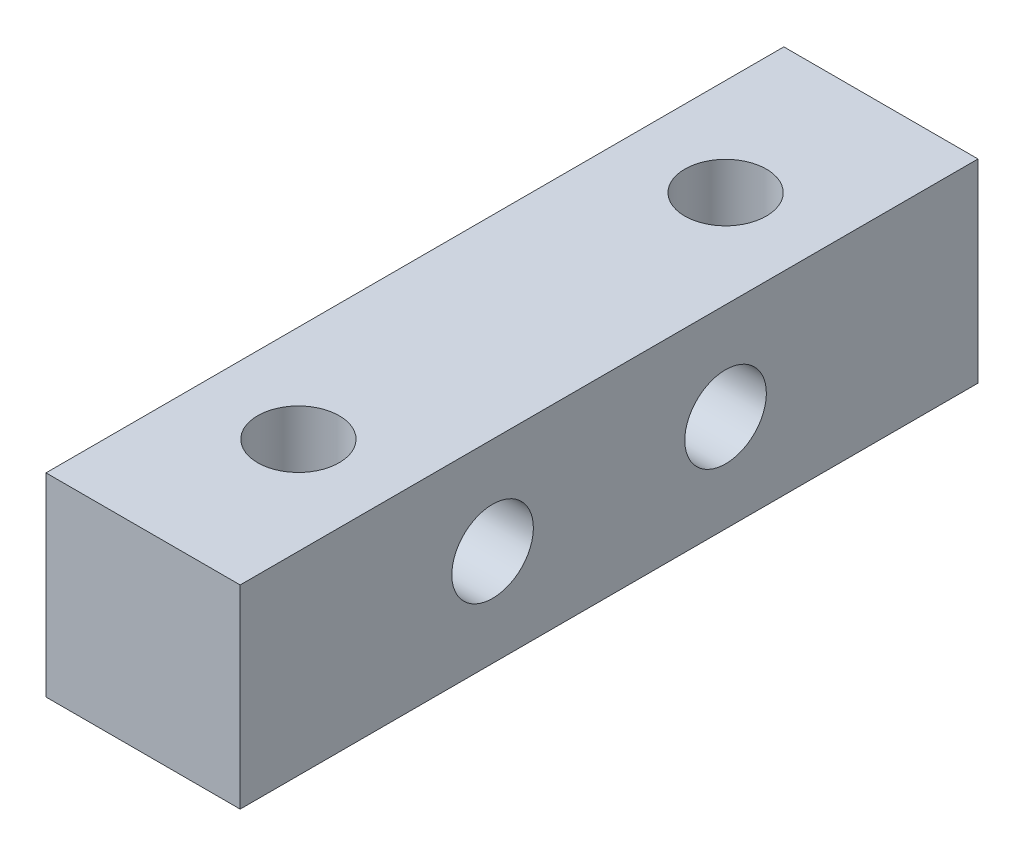
ISO-10303-21;
HEADER;
FILE_DESCRIPTION(('STEP AP214'),'2;1');
FILE_NAME('part.step','',(''),(''),'','','');
FILE_SCHEMA(('AUTOMOTIVE_DESIGN { 1 0 10303 214 1 1 1 1 }'));
ENDSEC;
DATA;
#1=APPLICATION_CONTEXT('core data for automotive mechanical design processes');
#2=APPLICATION_PROTOCOL_DEFINITION('international standard','automotive_design',2000,#1);
#3=PRODUCT_CONTEXT('',#1,'mechanical');
#4=PRODUCT('Part','Part','',(#3));
#5=PRODUCT_RELATED_PRODUCT_CATEGORY('part','',(#4));
#6=PRODUCT_DEFINITION_FORMATION('','',#4);
#7=PRODUCT_DEFINITION_CONTEXT('part definition',#1,'design');
#8=PRODUCT_DEFINITION('design','',#6,#7);
#9=PRODUCT_DEFINITION_SHAPE('','',#8);
#10=(LENGTH_UNIT() NAMED_UNIT(*) SI_UNIT(.MILLI.,.METRE.));
#11=(NAMED_UNIT(*) PLANE_ANGLE_UNIT() SI_UNIT($,.RADIAN.));
#12=(NAMED_UNIT(*) SI_UNIT($,.STERADIAN.) SOLID_ANGLE_UNIT());
#13=UNCERTAINTY_MEASURE_WITH_UNIT(LENGTH_MEASURE(1.E-05),#10,'distance_accuracy_value','');
#14=(GEOMETRIC_REPRESENTATION_CONTEXT(3) GLOBAL_UNCERTAINTY_ASSIGNED_CONTEXT((#13)) GLOBAL_UNIT_ASSIGNED_CONTEXT((#10,
#11,#12)) REPRESENTATION_CONTEXT('',''));
#15=CARTESIAN_POINT('',(0.,0.,0.));
#16=DIRECTION('',(0.,0.,1.));
#17=DIRECTION('',(1.,0.,0.));
#18=AXIS2_PLACEMENT_3D('',#15,#16,#17);
#19=CARTESIAN_POINT('',(0.,10.,38.));
#20=DIRECTION('',(1.,0.,0.));
#21=DIRECTION('',(0.,1.,0.));
#22=AXIS2_PLACEMENT_3D('',#19,#20,#21);
#23=PLANE('',#22);
#24=CARTESIAN_POINT('',(0.,5.,25.));
#25=DIRECTION('',(1.,0.,0.));
#26=DIRECTION('',(0.,1.,0.));
#27=AXIS2_PLACEMENT_3D('',#24,#25,#26);
#28=CIRCLE('',#27,2.1);
#29=CARTESIAN_POINT('',(0.,7.1,25.));
#30=VERTEX_POINT('',#29);
#31=EDGE_CURVE('E123',#30,#30,#28,.T.);
#32=ORIENTED_EDGE('',*,*,#31,.T.);
#33=EDGE_LOOP('',(#32));
#34=FACE_BOUND('',#33,.T.);
#35=CARTESIAN_POINT('',(0.,5.,13.));
#36=DIRECTION('',(1.,0.,0.));
#37=DIRECTION('',(0.,1.,0.));
#38=AXIS2_PLACEMENT_3D('',#35,#36,#37);
#39=CIRCLE('',#38,2.1);
#40=CARTESIAN_POINT('',(0.,7.1,13.));
#41=VERTEX_POINT('',#40);
#42=EDGE_CURVE('E128',#41,#41,#39,.T.);
#43=ORIENTED_EDGE('',*,*,#42,.T.);
#44=EDGE_LOOP('',(#43));
#45=FACE_BOUND('',#44,.T.);
#46=DIRECTION('',(0.,-1.,0.));
#47=VECTOR('',#46,1.);
#48=CARTESIAN_POINT('',(0.,10.,0.));
#49=LINE('',#48,#47);
#50=CARTESIAN_POINT('',(0.,10.,0.));
#51=VERTEX_POINT('',#50);
#52=CARTESIAN_POINT('',(0.,0.,0.));
#53=VERTEX_POINT('',#52);
#54=EDGE_CURVE('E100',#51,#53,#49,.T.);
#55=ORIENTED_EDGE('',*,*,#54,.T.);
#56=DIRECTION('',(0.,0.,-1.));
#57=VECTOR('',#56,1.);
#58=CARTESIAN_POINT('',(0.,0.,38.));
#59=LINE('',#58,#57);
#60=CARTESIAN_POINT('',(0.,0.,38.));
#61=VERTEX_POINT('',#60);
#62=EDGE_CURVE('E11',#61,#53,#59,.T.);
#63=ORIENTED_EDGE('',*,*,#62,.F.);
#64=DIRECTION('',(0.,-1.,0.));
#65=VECTOR('',#64,1.);
#66=CARTESIAN_POINT('',(0.,10.,38.));
#67=LINE('',#66,#65);
#68=CARTESIAN_POINT('',(0.,10.,38.));
#69=VERTEX_POINT('',#68);
#70=EDGE_CURVE('E88',#69,#61,#67,.T.);
#71=ORIENTED_EDGE('',*,*,#70,.F.);
#72=DIRECTION('',(0.,0.,-1.));
#73=VECTOR('',#72,1.);
#74=CARTESIAN_POINT('',(0.,10.,38.));
#75=LINE('',#74,#73);
#76=EDGE_CURVE('E96',#69,#51,#75,.T.);
#77=ORIENTED_EDGE('',*,*,#76,.T.);
#78=EDGE_LOOP('',(#55,#63,#71,#77));
#79=FACE_BOUND('',#78,.T.);
#80=ADVANCED_FACE('F37',(#34,#45,#79),#23,.F.);
#81=CARTESIAN_POINT('',(0.,0.,38.));
#82=DIRECTION('',(0.,1.,0.));
#83=DIRECTION('',(0.,0.,1.));
#84=AXIS2_PLACEMENT_3D('',#81,#82,#83);
#85=PLANE('',#84);
#86=CARTESIAN_POINT('',(5.,0.,8.));
#87=DIRECTION('',(0.,1.,0.));
#88=DIRECTION('',(0.,0.,1.));
#89=AXIS2_PLACEMENT_3D('',#86,#87,#88);
#90=CIRCLE('',#89,2.1);
#91=CARTESIAN_POINT('',(5.,0.,10.1));
#92=VERTEX_POINT('',#91);
#93=EDGE_CURVE('E103',#92,#92,#90,.T.);
#94=ORIENTED_EDGE('',*,*,#93,.T.);
#95=EDGE_LOOP('',(#94));
#96=FACE_BOUND('',#95,.T.);
#97=CARTESIAN_POINT('',(5.,0.,30.));
#98=DIRECTION('',(0.,1.,0.));
#99=DIRECTION('',(0.,0.,1.));
#100=AXIS2_PLACEMENT_3D('',#97,#98,#99);
#101=CIRCLE('',#100,2.1);
#102=CARTESIAN_POINT('',(5.,0.,32.1));
#103=VERTEX_POINT('',#102);
#104=EDGE_CURVE('E116',#103,#103,#101,.T.);
#105=ORIENTED_EDGE('',*,*,#104,.T.);
#106=EDGE_LOOP('',(#105));
#107=FACE_BOUND('',#106,.T.);
#108=DIRECTION('',(1.,0.,0.));
#109=VECTOR('',#108,1.);
#110=CARTESIAN_POINT('',(0.,0.,0.));
#111=LINE('',#110,#109);
#112=CARTESIAN_POINT('',(10.,0.,0.));
#113=VERTEX_POINT('',#112);
#114=EDGE_CURVE('E92',#53,#113,#111,.T.);
#115=ORIENTED_EDGE('',*,*,#114,.T.);
#116=DIRECTION('',(0.,0.,-1.));
#117=VECTOR('',#116,1.);
#118=CARTESIAN_POINT('',(10.,0.,38.));
#119=LINE('',#118,#117);
#120=CARTESIAN_POINT('',(10.,0.,38.));
#121=VERTEX_POINT('',#120);
#122=EDGE_CURVE('E45',#121,#113,#119,.T.);
#123=ORIENTED_EDGE('',*,*,#122,.F.);
#124=DIRECTION('',(1.,0.,0.));
#125=VECTOR('',#124,1.);
#126=CARTESIAN_POINT('',(0.,0.,38.));
#127=LINE('',#126,#125);
#128=EDGE_CURVE('E83',#61,#121,#127,.T.);
#129=ORIENTED_EDGE('',*,*,#128,.F.);
#130=ORIENTED_EDGE('',*,*,#62,.T.);
#131=EDGE_LOOP('',(#115,#123,#129,#130));
#132=FACE_BOUND('',#131,.T.);
#133=ADVANCED_FACE('F91',(#96,#107,#132),#85,.F.);
#134=CARTESIAN_POINT('',(10.,10.,38.));
#135=DIRECTION('',(-1.,0.,0.));
#136=DIRECTION('',(0.,-1.,0.));
#137=AXIS2_PLACEMENT_3D('',#134,#135,#136);
#138=PLANE('',#137);
#139=CARTESIAN_POINT('',(10.,5.,25.));
#140=DIRECTION('',(1.,0.,0.));
#141=DIRECTION('',(0.,1.,0.));
#142=AXIS2_PLACEMENT_3D('',#139,#140,#141);
#143=CIRCLE('',#142,2.1);
#144=CARTESIAN_POINT('',(10.,7.1,25.));
#145=VERTEX_POINT('',#144);
#146=EDGE_CURVE('E131',#145,#145,#143,.T.);
#147=ORIENTED_EDGE('',*,*,#146,.F.);
#148=EDGE_LOOP('',(#147));
#149=FACE_BOUND('',#148,.T.);
#150=CARTESIAN_POINT('',(10.,5.,13.));
#151=DIRECTION('',(1.,0.,0.));
#152=DIRECTION('',(0.,1.,0.));
#153=AXIS2_PLACEMENT_3D('',#150,#151,#152);
#154=CIRCLE('',#153,2.1);
#155=CARTESIAN_POINT('',(10.,7.1,13.));
#156=VERTEX_POINT('',#155);
#157=EDGE_CURVE('E132',#156,#156,#154,.T.);
#158=ORIENTED_EDGE('',*,*,#157,.F.);
#159=EDGE_LOOP('',(#158));
#160=FACE_BOUND('',#159,.T.);
#161=DIRECTION('',(0.,1.,0.));
#162=VECTOR('',#161,1.);
#163=CARTESIAN_POINT('',(10.,10.,0.));
#164=LINE('',#163,#162);
#165=CARTESIAN_POINT('',(10.,10.,0.));
#166=VERTEX_POINT('',#165);
#167=EDGE_CURVE('E70',#113,#166,#164,.T.);
#168=ORIENTED_EDGE('',*,*,#167,.T.);
#169=DIRECTION('',(0.,0.,-1.));
#170=VECTOR('',#169,1.);
#171=CARTESIAN_POINT('',(10.,10.,38.));
#172=LINE('',#171,#170);
#173=CARTESIAN_POINT('',(10.,10.,38.));
#174=VERTEX_POINT('',#173);
#175=EDGE_CURVE('E93',#174,#166,#172,.T.);
#176=ORIENTED_EDGE('',*,*,#175,.F.);
#177=DIRECTION('',(0.,1.,0.));
#178=VECTOR('',#177,1.);
#179=CARTESIAN_POINT('',(10.,10.,38.));
#180=LINE('',#179,#178);
#181=EDGE_CURVE('E86',#121,#174,#180,.T.);
#182=ORIENTED_EDGE('',*,*,#181,.F.);
#183=ORIENTED_EDGE('',*,*,#122,.T.);
#184=EDGE_LOOP('',(#168,#176,#182,#183));
#185=FACE_BOUND('',#184,.T.);
#186=ADVANCED_FACE('F94',(#149,#160,#185),#138,.F.);
#187=CARTESIAN_POINT('',(0.,10.,38.));
#188=DIRECTION('',(0.,-1.,0.));
#189=DIRECTION('',(0.,0.,-1.));
#190=AXIS2_PLACEMENT_3D('',#187,#188,#189);
#191=PLANE('',#190);
#192=CARTESIAN_POINT('',(5.,10.,8.));
#193=DIRECTION('',(0.,1.,0.));
#194=DIRECTION('',(0.,0.,1.));
#195=AXIS2_PLACEMENT_3D('',#192,#193,#194);
#196=CIRCLE('',#195,2.1);
#197=CARTESIAN_POINT('',(5.,10.,10.1));
#198=VERTEX_POINT('',#197);
#199=EDGE_CURVE('E119',#198,#198,#196,.T.);
#200=ORIENTED_EDGE('',*,*,#199,.F.);
#201=EDGE_LOOP('',(#200));
#202=FACE_BOUND('',#201,.T.);
#203=CARTESIAN_POINT('',(5.,10.,30.));
#204=DIRECTION('',(0.,1.,0.));
#205=DIRECTION('',(0.,0.,1.));
#206=AXIS2_PLACEMENT_3D('',#203,#204,#205);
#207=CIRCLE('',#206,2.1);
#208=CARTESIAN_POINT('',(5.,10.,32.1));
#209=VERTEX_POINT('',#208);
#210=EDGE_CURVE('E120',#209,#209,#207,.T.);
#211=ORIENTED_EDGE('',*,*,#210,.F.);
#212=EDGE_LOOP('',(#211));
#213=FACE_BOUND('',#212,.T.);
#214=DIRECTION('',(-1.,0.,0.));
#215=VECTOR('',#214,1.);
#216=CARTESIAN_POINT('',(0.,10.,0.));
#217=LINE('',#216,#215);
#218=EDGE_CURVE('E76',#166,#51,#217,.T.);
#219=ORIENTED_EDGE('',*,*,#218,.T.);
#220=ORIENTED_EDGE('',*,*,#76,.F.);
#221=DIRECTION('',(-1.,0.,0.));
#222=VECTOR('',#221,1.);
#223=CARTESIAN_POINT('',(0.,10.,38.));
#224=LINE('',#223,#222);
#225=EDGE_CURVE('E53',#174,#69,#224,.T.);
#226=ORIENTED_EDGE('',*,*,#225,.F.);
#227=ORIENTED_EDGE('',*,*,#175,.T.);
#228=EDGE_LOOP('',(#219,#220,#226,#227));
#229=FACE_BOUND('',#228,.T.);
#230=ADVANCED_FACE('F108',(#202,#213,#229),#191,.F.);
#231=CARTESIAN_POINT('',(0.,0.,38.));
#232=DIRECTION('',(0.,0.,1.));
#233=DIRECTION('',(1.,0.,0.));
#234=AXIS2_PLACEMENT_3D('',#231,#232,#233);
#235=PLANE('',#234);
#236=ORIENTED_EDGE('',*,*,#70,.T.);
#237=ORIENTED_EDGE('',*,*,#128,.T.);
#238=ORIENTED_EDGE('',*,*,#181,.T.);
#239=ORIENTED_EDGE('',*,*,#225,.T.);
#240=EDGE_LOOP('',(#236,#237,#238,#239));
#241=FACE_BOUND('',#240,.T.);
#242=ADVANCED_FACE('F84',(#241),#235,.T.);
#243=CARTESIAN_POINT('',(0.,0.,0.));
#244=DIRECTION('',(0.,0.,1.));
#245=DIRECTION('',(1.,0.,0.));
#246=AXIS2_PLACEMENT_3D('',#243,#244,#245);
#247=PLANE('',#246);
#248=ORIENTED_EDGE('',*,*,#54,.F.);
#249=ORIENTED_EDGE('',*,*,#218,.F.);
#250=ORIENTED_EDGE('',*,*,#167,.F.);
#251=ORIENTED_EDGE('',*,*,#114,.F.);
#252=EDGE_LOOP('',(#248,#249,#250,#251));
#253=FACE_BOUND('',#252,.T.);
#254=ADVANCED_FACE('F111',(#253),#247,.F.);
#255=CARTESIAN_POINT('',(5.,-12.,30.));
#256=DIRECTION('',(0.,1.,0.));
#257=DIRECTION('',(0.,0.,1.));
#258=AXIS2_PLACEMENT_3D('',#255,#256,#257);
#259=CYLINDRICAL_SURFACE('',#258,2.1);
#260=ORIENTED_EDGE('',*,*,#210,.T.);
#261=EDGE_LOOP('',(#260));
#262=FACE_BOUND('',#261,.T.);
#263=ORIENTED_EDGE('',*,*,#104,.F.);
#264=EDGE_LOOP('',(#263));
#265=FACE_BOUND('',#264,.T.);
#266=ADVANCED_FACE('F167',(#262,#265),#259,.F.);
#267=CARTESIAN_POINT('',(5.,-12.,8.));
#268=DIRECTION('',(0.,1.,0.));
#269=DIRECTION('',(0.,0.,1.));
#270=AXIS2_PLACEMENT_3D('',#267,#268,#269);
#271=CYLINDRICAL_SURFACE('',#270,2.1);
#272=ORIENTED_EDGE('',*,*,#199,.T.);
#273=EDGE_LOOP('',(#272));
#274=FACE_BOUND('',#273,.T.);
#275=ORIENTED_EDGE('',*,*,#93,.F.);
#276=EDGE_LOOP('',(#275));
#277=FACE_BOUND('',#276,.T.);
#278=ADVANCED_FACE('F149',(#274,#277),#271,.F.);
#279=CARTESIAN_POINT('',(-12.,5.,13.));
#280=DIRECTION('',(1.,0.,0.));
#281=DIRECTION('',(0.,1.,0.));
#282=AXIS2_PLACEMENT_3D('',#279,#280,#281);
#283=CYLINDRICAL_SURFACE('',#282,2.1);
#284=ORIENTED_EDGE('',*,*,#157,.T.);
#285=EDGE_LOOP('',(#284));
#286=FACE_BOUND('',#285,.T.);
#287=ORIENTED_EDGE('',*,*,#42,.F.);
#288=EDGE_LOOP('',(#287));
#289=FACE_BOUND('',#288,.T.);
#290=ADVANCED_FACE('F146',(#286,#289),#283,.F.);
#291=CARTESIAN_POINT('',(-12.,5.,25.));
#292=DIRECTION('',(1.,0.,0.));
#293=DIRECTION('',(0.,1.,0.));
#294=AXIS2_PLACEMENT_3D('',#291,#292,#293);
#295=CYLINDRICAL_SURFACE('',#294,2.1);
#296=ORIENTED_EDGE('',*,*,#146,.T.);
#297=EDGE_LOOP('',(#296));
#298=FACE_BOUND('',#297,.T.);
#299=ORIENTED_EDGE('',*,*,#31,.F.);
#300=EDGE_LOOP('',(#299));
#301=FACE_BOUND('',#300,.T.);
#302=ADVANCED_FACE('F138',(#298,#301),#295,.F.);
#303=CLOSED_SHELL('',(#80,#133,#186,#230,#242,#254,#266,#278,#290,#302));
#304=MANIFOLD_SOLID_BREP('B2',#303);
#305=ADVANCED_BREP_SHAPE_REPRESENTATION('',(#18,#304),#14);
#306=SHAPE_DEFINITION_REPRESENTATION(#9,#305);
ENDSEC;
END-ISO-10303-21;
